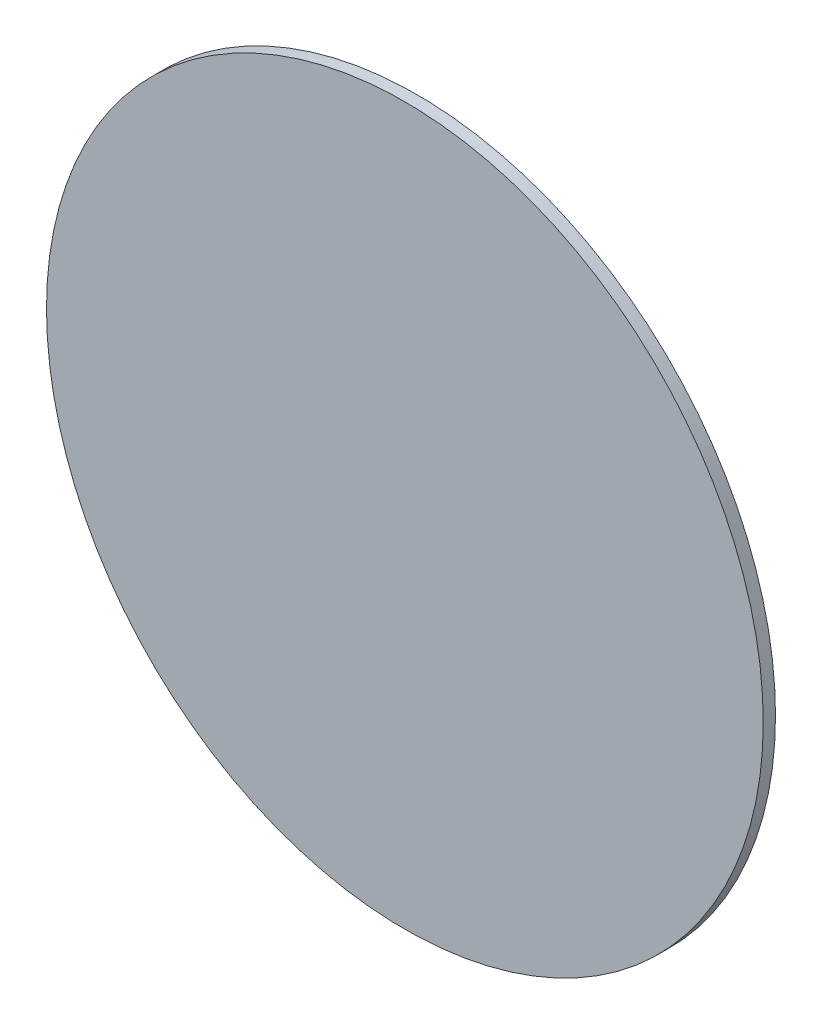
ISO-10303-21;
HEADER;
FILE_DESCRIPTION(('STEP AP214'),'2;1');
FILE_NAME('part.step','',(''),(''),'','','');
FILE_SCHEMA(('AUTOMOTIVE_DESIGN { 1 0 10303 214 1 1 1 1 }'));
ENDSEC;
DATA;
#1=APPLICATION_CONTEXT('core data for automotive mechanical design processes');
#2=APPLICATION_PROTOCOL_DEFINITION('international standard','automotive_design',2000,#1);
#3=PRODUCT_CONTEXT('',#1,'mechanical');
#4=PRODUCT('Part','Part','',(#3));
#5=PRODUCT_RELATED_PRODUCT_CATEGORY('part','',(#4));
#6=PRODUCT_DEFINITION_FORMATION('','',#4);
#7=PRODUCT_DEFINITION_CONTEXT('part definition',#1,'design');
#8=PRODUCT_DEFINITION('design','',#6,#7);
#9=PRODUCT_DEFINITION_SHAPE('','',#8);
#10=(LENGTH_UNIT() NAMED_UNIT(*) SI_UNIT(.MILLI.,.METRE.));
#11=(NAMED_UNIT(*) PLANE_ANGLE_UNIT() SI_UNIT($,.RADIAN.));
#12=(NAMED_UNIT(*) SI_UNIT($,.STERADIAN.) SOLID_ANGLE_UNIT());
#13=UNCERTAINTY_MEASURE_WITH_UNIT(LENGTH_MEASURE(1.E-05),#10,'distance_accuracy_value','');
#14=(GEOMETRIC_REPRESENTATION_CONTEXT(3) GLOBAL_UNCERTAINTY_ASSIGNED_CONTEXT((#13)) GLOBAL_UNIT_ASSIGNED_CONTEXT((#10,
#11,#12)) REPRESENTATION_CONTEXT('',''));
#15=CARTESIAN_POINT('',(0.,0.,0.));
#16=DIRECTION('',(0.,0.,1.));
#17=DIRECTION('',(1.,0.,0.));
#18=AXIS2_PLACEMENT_3D('',#15,#16,#17);
#19=CARTESIAN_POINT('',(0.,0.,5.));
#20=DIRECTION('',(0.,0.,-1.));
#21=DIRECTION('',(-1.,0.,0.));
#22=AXIS2_PLACEMENT_3D('',#19,#20,#21);
#23=CYLINDRICAL_SURFACE('',#22,146.4);
#24=CARTESIAN_POINT('',(0.,0.,5.));
#25=DIRECTION('',(0.,0.,1.));
#26=DIRECTION('',(1.,0.,0.));
#27=AXIS2_PLACEMENT_3D('',#24,#25,#26);
#28=CIRCLE('',#27,146.4);
#29=CARTESIAN_POINT('',(146.4,0.,5.));
#30=VERTEX_POINT('',#29);
#31=EDGE_CURVE('E10',#30,#30,#28,.T.);
#32=ORIENTED_EDGE('',*,*,#31,.F.);
#33=EDGE_LOOP('',(#32));
#34=FACE_BOUND('',#33,.T.);
#35=CARTESIAN_POINT('',(0.,0.,0.));
#36=DIRECTION('',(0.,0.,1.));
#37=DIRECTION('',(1.,0.,0.));
#38=AXIS2_PLACEMENT_3D('',#35,#36,#37);
#39=CIRCLE('',#38,146.4);
#40=CARTESIAN_POINT('',(146.4,0.,0.));
#41=VERTEX_POINT('',#40);
#42=EDGE_CURVE('E34',#41,#41,#39,.T.);
#43=ORIENTED_EDGE('',*,*,#42,.T.);
#44=EDGE_LOOP('',(#43));
#45=FACE_BOUND('',#44,.T.);
#46=ADVANCED_FACE('F31',(#34,#45),#23,.T.);
#47=CARTESIAN_POINT('',(0.,0.,5.));
#48=DIRECTION('',(0.,0.,1.));
#49=DIRECTION('',(1.,0.,0.));
#50=AXIS2_PLACEMENT_3D('',#47,#48,#49);
#51=PLANE('',#50);
#52=ORIENTED_EDGE('',*,*,#31,.T.);
#53=EDGE_LOOP('',(#52));
#54=FACE_BOUND('',#53,.T.);
#55=ADVANCED_FACE('F46',(#54),#51,.T.);
#56=CARTESIAN_POINT('',(0.,0.,0.));
#57=DIRECTION('',(0.,0.,1.));
#58=DIRECTION('',(1.,0.,0.));
#59=AXIS2_PLACEMENT_3D('',#56,#57,#58);
#60=PLANE('',#59);
#61=ORIENTED_EDGE('',*,*,#42,.F.);
#62=EDGE_LOOP('',(#61));
#63=FACE_BOUND('',#62,.T.);
#64=ADVANCED_FACE('F44',(#63),#60,.F.);
#65=CLOSED_SHELL('',(#46,#55,#64));
#66=MANIFOLD_SOLID_BREP('B2',#65);
#67=ADVANCED_BREP_SHAPE_REPRESENTATION('',(#18,#66),#14);
#68=SHAPE_DEFINITION_REPRESENTATION(#9,#67);
ENDSEC;
END-ISO-10303-21;
